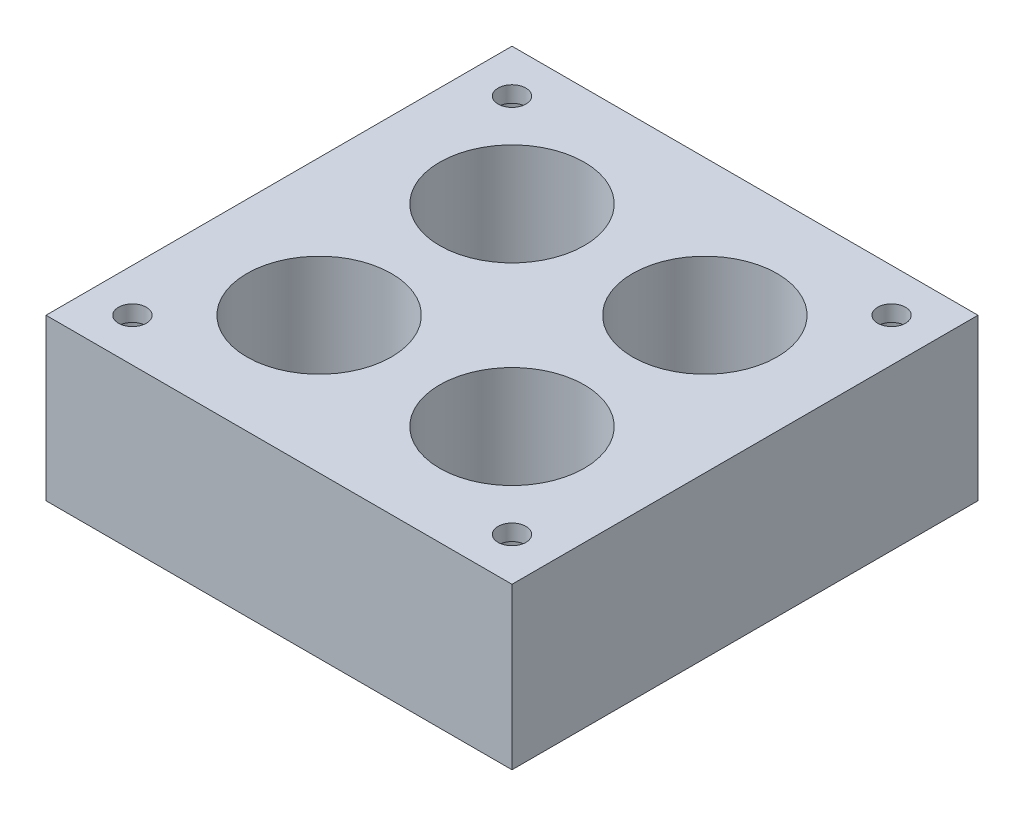
ISO-10303-21;
HEADER;
FILE_DESCRIPTION(('STEP AP214'),'2;1');
FILE_NAME('part.step','',(''),(''),'','','');
FILE_SCHEMA(('AUTOMOTIVE_DESIGN { 1 0 10303 214 1 1 1 1 }'));
ENDSEC;
DATA;
#1=APPLICATION_CONTEXT('core data for automotive mechanical design processes');
#2=APPLICATION_PROTOCOL_DEFINITION('international standard','automotive_design',2000,#1);
#3=PRODUCT_CONTEXT('',#1,'mechanical');
#4=PRODUCT('Part','Part','',(#3));
#5=PRODUCT_RELATED_PRODUCT_CATEGORY('part','',(#4));
#6=PRODUCT_DEFINITION_FORMATION('','',#4);
#7=PRODUCT_DEFINITION_CONTEXT('part definition',#1,'design');
#8=PRODUCT_DEFINITION('design','',#6,#7);
#9=PRODUCT_DEFINITION_SHAPE('','',#8);
#10=(LENGTH_UNIT() NAMED_UNIT(*) SI_UNIT(.MILLI.,.METRE.));
#11=(NAMED_UNIT(*) PLANE_ANGLE_UNIT() SI_UNIT($,.RADIAN.));
#12=(NAMED_UNIT(*) SI_UNIT($,.STERADIAN.) SOLID_ANGLE_UNIT());
#13=UNCERTAINTY_MEASURE_WITH_UNIT(LENGTH_MEASURE(1.E-05),#10,'distance_accuracy_value','');
#14=(GEOMETRIC_REPRESENTATION_CONTEXT(3) GLOBAL_UNCERTAINTY_ASSIGNED_CONTEXT((#13)) GLOBAL_UNIT_ASSIGNED_CONTEXT((#10,
#11,#12)) REPRESENTATION_CONTEXT('',''));
#15=CARTESIAN_POINT('',(0.,0.,0.));
#16=DIRECTION('',(0.,0.,1.));
#17=DIRECTION('',(1.,0.,0.));
#18=AXIS2_PLACEMENT_3D('',#15,#16,#17);
#19=CARTESIAN_POINT('',(13.5774627629243,12.7,-11.723859629765));
#20=DIRECTION('',(0.,-1.,0.));
#21=DIRECTION('',(0.,0.,-1.));
#22=AXIS2_PLACEMENT_3D('',#19,#20,#21);
#23=CYLINDRICAL_SURFACE('',#22,1.0999978);
#24=CARTESIAN_POINT('',(13.5774627629243,12.7,-11.723859629765));
#25=DIRECTION('',(0.,1.,0.));
#26=DIRECTION('',(0.,0.,-1.));
#27=AXIS2_PLACEMENT_3D('',#24,#25,#26);
#28=CIRCLE('',#27,1.0999978);
#29=CARTESIAN_POINT('',(13.5774627629243,12.7,-12.823857429765));
#30=VERTEX_POINT('',#29);
#31=EDGE_CURVE('E186',#30,#30,#28,.T.);
#32=ORIENTED_EDGE('',*,*,#31,.T.);
#33=EDGE_LOOP('',(#32));
#34=FACE_BOUND('',#33,.T.);
#35=CARTESIAN_POINT('',(13.5774627629243,11.43,-11.723859629765));
#36=DIRECTION('',(0.,-1.,0.));
#37=DIRECTION('',(0.,0.,-1.));
#38=AXIS2_PLACEMENT_3D('',#35,#36,#37);
#39=CIRCLE('',#38,1.0999978);
#40=CARTESIAN_POINT('',(13.5774627629243,11.43,-12.823857429765));
#41=VERTEX_POINT('',#40);
#42=EDGE_CURVE('E132',#41,#41,#39,.T.);
#43=ORIENTED_EDGE('',*,*,#42,.T.);
#44=EDGE_LOOP('',(#43));
#45=FACE_BOUND('',#44,.T.);
#46=ADVANCED_FACE('F32',(#34,#45),#23,.F.);
#47=CARTESIAN_POINT('',(-16.4225280370757,12.7,18.276131170235));
#48=DIRECTION('',(0.,-1.,0.));
#49=DIRECTION('',(0.,0.,-1.));
#50=AXIS2_PLACEMENT_3D('',#47,#48,#49);
#51=CYLINDRICAL_SURFACE('',#50,1.0999978);
#52=CARTESIAN_POINT('',(-16.4225280370757,12.7,18.276131170235));
#53=DIRECTION('',(0.,1.,0.));
#54=DIRECTION('',(0.,0.,-1.));
#55=AXIS2_PLACEMENT_3D('',#52,#53,#54);
#56=CIRCLE('',#55,1.0999978);
#57=CARTESIAN_POINT('',(-16.4225280370757,12.7,17.176133370235));
#58=VERTEX_POINT('',#57);
#59=EDGE_CURVE('E180',#58,#58,#56,.T.);
#60=ORIENTED_EDGE('',*,*,#59,.T.);
#61=EDGE_LOOP('',(#60));
#62=FACE_BOUND('',#61,.T.);
#63=CARTESIAN_POINT('',(-16.4225280370757,11.43,18.276131170235));
#64=DIRECTION('',(0.,-1.,0.));
#65=DIRECTION('',(0.,0.,-1.));
#66=AXIS2_PLACEMENT_3D('',#63,#64,#65);
#67=CIRCLE('',#66,1.0999978);
#68=CARTESIAN_POINT('',(-16.4225280370757,11.43,17.176133370235));
#69=VERTEX_POINT('',#68);
#70=EDGE_CURVE('E125',#69,#69,#67,.T.);
#71=ORIENTED_EDGE('',*,*,#70,.T.);
#72=EDGE_LOOP('',(#71));
#73=FACE_BOUND('',#72,.T.);
#74=ADVANCED_FACE('F212',(#62,#73),#51,.F.);
#75=CARTESIAN_POINT('',(6.19746736292429,12.7,10.896135770235));
#76=DIRECTION('',(0.,-1.,0.));
#77=DIRECTION('',(0.,0.,-1.));
#78=AXIS2_PLACEMENT_3D('',#75,#76,#77);
#79=CYLINDRICAL_SURFACE('',#78,2.159);
#80=CARTESIAN_POINT('',(6.19746736292429,0.,10.896135770235));
#81=DIRECTION('',(0.,1.,0.));
#82=DIRECTION('',(0.,0.,1.));
#83=AXIS2_PLACEMENT_3D('',#80,#81,#82);
#84=CIRCLE('',#83,2.159);
#85=CARTESIAN_POINT('',(6.19746736292429,0.,13.055135770235));
#86=VERTEX_POINT('',#85);
#87=EDGE_CURVE('E171',#86,#86,#84,.T.);
#88=ORIENTED_EDGE('',*,*,#87,.F.);
#89=EDGE_LOOP('',(#88));
#90=FACE_BOUND('',#89,.T.);
#91=CARTESIAN_POINT('',(6.19746736292429,1.27,10.896135770235));
#92=DIRECTION('',(0.,1.,0.));
#93=DIRECTION('',(0.,0.,1.));
#94=AXIS2_PLACEMENT_3D('',#91,#92,#93);
#95=CIRCLE('',#94,2.159);
#96=CARTESIAN_POINT('',(6.19746736292429,1.27,13.055135770235));
#97=VERTEX_POINT('',#96);
#98=EDGE_CURVE('E117',#97,#97,#95,.T.);
#99=ORIENTED_EDGE('',*,*,#98,.T.);
#100=EDGE_LOOP('',(#99));
#101=FACE_BOUND('',#100,.T.);
#102=ADVANCED_FACE('F205',(#90,#101),#79,.F.);
#103=CARTESIAN_POINT('',(-9.04253263707571,12.7,-4.34386422976501));
#104=DIRECTION('',(0.,-1.,0.));
#105=DIRECTION('',(0.,0.,-1.));
#106=AXIS2_PLACEMENT_3D('',#103,#104,#105);
#107=CYLINDRICAL_SURFACE('',#106,2.159);
#108=CARTESIAN_POINT('',(-9.04253263707571,0.,-4.34386422976501));
#109=DIRECTION('',(0.,1.,0.));
#110=DIRECTION('',(0.,0.,1.));
#111=AXIS2_PLACEMENT_3D('',#108,#109,#110);
#112=CIRCLE('',#111,2.159);
#113=CARTESIAN_POINT('',(-9.04253263707571,0.,-2.18486422976501));
#114=VERTEX_POINT('',#113);
#115=EDGE_CURVE('E174',#114,#114,#112,.T.);
#116=ORIENTED_EDGE('',*,*,#115,.F.);
#117=EDGE_LOOP('',(#116));
#118=FACE_BOUND('',#117,.T.);
#119=CARTESIAN_POINT('',(-9.04253263707571,1.27,-4.34386422976501));
#120=DIRECTION('',(0.,1.,0.));
#121=DIRECTION('',(0.,0.,1.));
#122=AXIS2_PLACEMENT_3D('',#119,#120,#121);
#123=CIRCLE('',#122,2.159);
#124=CARTESIAN_POINT('',(-9.04253263707571,1.27,-2.18486422976501));
#125=VERTEX_POINT('',#124);
#126=EDGE_CURVE('E109',#125,#125,#123,.T.);
#127=ORIENTED_EDGE('',*,*,#126,.T.);
#128=EDGE_LOOP('',(#127));
#129=FACE_BOUND('',#128,.T.);
#130=ADVANCED_FACE('F196',(#118,#129),#107,.F.);
#131=CARTESIAN_POINT('',(0.,12.7,0.));
#132=DIRECTION('',(0.,1.,0.));
#133=DIRECTION('',(0.,0.,1.));
#134=AXIS2_PLACEMENT_3D('',#131,#132,#133);
#135=PLANE('',#134);
#136=CARTESIAN_POINT('',(6.19746736292428,12.7,-4.34386422976501));
#137=DIRECTION('',(0.,1.,0.));
#138=DIRECTION('',(0.,0.,-1.));
#139=AXIS2_PLACEMENT_3D('',#136,#137,#138);
#140=CIRCLE('',#139,5.715);
#141=CARTESIAN_POINT('',(6.19746736292428,12.7,-10.058864229765));
#142=VERTEX_POINT('',#141);
#143=EDGE_CURVE('E151',#142,#142,#140,.T.);
#144=ORIENTED_EDGE('',*,*,#143,.F.);
#145=EDGE_LOOP('',(#144));
#146=FACE_BOUND('',#145,.T.);
#147=CARTESIAN_POINT('',(6.19746736292428,12.7,10.896135770235));
#148=DIRECTION('',(0.,1.,0.));
#149=DIRECTION('',(0.,0.,1.));
#150=AXIS2_PLACEMENT_3D('',#147,#148,#149);
#151=CIRCLE('',#150,5.715);
#152=CARTESIAN_POINT('',(6.19746736292428,12.7,16.611135770235));
#153=VERTEX_POINT('',#152);
#154=EDGE_CURVE('E157',#153,#153,#151,.T.);
#155=ORIENTED_EDGE('',*,*,#154,.F.);
#156=EDGE_LOOP('',(#155));
#157=FACE_BOUND('',#156,.T.);
#158=CARTESIAN_POINT('',(-9.04253263707571,12.7,10.896135770235));
#159=DIRECTION('',(0.,1.,0.));
#160=DIRECTION('',(0.,0.,-1.));
#161=AXIS2_PLACEMENT_3D('',#158,#159,#160);
#162=CIRCLE('',#161,5.715);
#163=CARTESIAN_POINT('',(-9.04253263707571,12.7,5.18113577023499));
#164=VERTEX_POINT('',#163);
#165=EDGE_CURVE('E128',#164,#164,#162,.T.);
#166=ORIENTED_EDGE('',*,*,#165,.F.);
#167=EDGE_LOOP('',(#166));
#168=FACE_BOUND('',#167,.T.);
#169=CARTESIAN_POINT('',(-9.04253263707571,12.7,-4.34386422976501));
#170=DIRECTION('',(0.,1.,0.));
#171=DIRECTION('',(0.,0.,1.));
#172=AXIS2_PLACEMENT_3D('',#169,#170,#171);
#173=CIRCLE('',#172,5.715);
#174=CARTESIAN_POINT('',(-9.04253263707571,12.7,1.37113577023499));
#175=VERTEX_POINT('',#174);
#176=EDGE_CURVE('E124',#175,#175,#173,.T.);
#177=ORIENTED_EDGE('',*,*,#176,.F.);
#178=EDGE_LOOP('',(#177));
#179=FACE_BOUND('',#178,.T.);
#180=CARTESIAN_POINT('',(13.5774627629243,12.7,18.276131170235));
#181=DIRECTION('',(0.,1.,0.));
#182=DIRECTION('',(0.,0.,1.));
#183=AXIS2_PLACEMENT_3D('',#180,#181,#182);
#184=CIRCLE('',#183,1.0999978);
#185=CARTESIAN_POINT('',(13.5774627629243,12.7,19.376128970235));
#186=VERTEX_POINT('',#185);
#187=EDGE_CURVE('E183',#186,#186,#184,.T.);
#188=ORIENTED_EDGE('',*,*,#187,.F.);
#189=EDGE_LOOP('',(#188));
#190=FACE_BOUND('',#189,.T.);
#191=CARTESIAN_POINT('',(-16.4225280370757,12.7,-11.723859629765));
#192=DIRECTION('',(0.,1.,0.));
#193=DIRECTION('',(0.,0.,1.));
#194=AXIS2_PLACEMENT_3D('',#191,#192,#193);
#195=CIRCLE('',#194,1.0999978);
#196=CARTESIAN_POINT('',(-16.4225280370757,12.7,-10.623861829765));
#197=VERTEX_POINT('',#196);
#198=EDGE_CURVE('E103',#197,#197,#195,.T.);
#199=ORIENTED_EDGE('',*,*,#198,.F.);
#200=EDGE_LOOP('',(#199));
#201=FACE_BOUND('',#200,.T.);
#202=DIRECTION('',(0.,0.,1.));
#203=VECTOR('',#202,1.);
#204=CARTESIAN_POINT('',(-19.8375326370757,12.7,-15.138864229765));
#205=LINE('',#204,#203);
#206=CARTESIAN_POINT('',(-19.8375326370757,12.7,-15.138864229765));
#207=VERTEX_POINT('',#206);
#208=CARTESIAN_POINT('',(-19.8375326370757,12.7,21.691135770235));
#209=VERTEX_POINT('',#208);
#210=EDGE_CURVE('E87',#207,#209,#205,.T.);
#211=ORIENTED_EDGE('',*,*,#210,.T.);
#212=DIRECTION('',(1.,0.,0.));
#213=VECTOR('',#212,1.);
#214=CARTESIAN_POINT('',(-19.8375326370757,12.7,21.691135770235));
#215=LINE('',#214,#213);
#216=CARTESIAN_POINT('',(16.9924673629243,12.7,21.691135770235));
#217=VERTEX_POINT('',#216);
#218=EDGE_CURVE('E81',#209,#217,#215,.T.);
#219=ORIENTED_EDGE('',*,*,#218,.T.);
#220=DIRECTION('',(0.,0.,-1.));
#221=VECTOR('',#220,1.);
#222=CARTESIAN_POINT('',(16.9924673629243,12.7,-15.138864229765));
#223=LINE('',#222,#221);
#224=CARTESIAN_POINT('',(16.9924673629243,12.7,-15.138864229765));
#225=VERTEX_POINT('',#224);
#226=EDGE_CURVE('E85',#217,#225,#223,.T.);
#227=ORIENTED_EDGE('',*,*,#226,.T.);
#228=DIRECTION('',(-1.,0.,0.));
#229=VECTOR('',#228,1.);
#230=CARTESIAN_POINT('',(-19.8375326370757,12.7,-15.138864229765));
#231=LINE('',#230,#229);
#232=EDGE_CURVE('E51',#225,#207,#231,.T.);
#233=ORIENTED_EDGE('',*,*,#232,.T.);
#234=EDGE_LOOP('',(#211,#219,#227,#233));
#235=FACE_BOUND('',#234,.T.);
#236=ORIENTED_EDGE('',*,*,#31,.F.);
#237=EDGE_LOOP('',(#236));
#238=FACE_BOUND('',#237,.T.);
#239=ORIENTED_EDGE('',*,*,#59,.F.);
#240=EDGE_LOOP('',(#239));
#241=FACE_BOUND('',#240,.T.);
#242=ADVANCED_FACE('F82',(#146,#157,#168,#179,#190,#201,#235,#238,#241),#135,.T.);
#243=CARTESIAN_POINT('',(0.,0.,0.));
#244=DIRECTION('',(0.,1.,0.));
#245=DIRECTION('',(0.,0.,1.));
#246=AXIS2_PLACEMENT_3D('',#243,#244,#245);
#247=PLANE('',#246);
#248=CARTESIAN_POINT('',(13.5774627629243,0.,18.276131170235));
#249=DIRECTION('',(0.,-1.,0.));
#250=DIRECTION('',(0.,0.,1.));
#251=AXIS2_PLACEMENT_3D('',#248,#249,#250);
#252=CIRCLE('',#251,2.54);
#253=CARTESIAN_POINT('',(13.5774627629243,0.,20.816131170235));
#254=VERTEX_POINT('',#253);
#255=EDGE_CURVE('E356',#254,#254,#252,.T.);
#256=ORIENTED_EDGE('',*,*,#255,.F.);
#257=EDGE_LOOP('',(#256));
#258=FACE_BOUND('',#257,.T.);
#259=CARTESIAN_POINT('',(13.5774627629243,0.,-11.723859629765));
#260=DIRECTION('',(0.,-1.,0.));
#261=DIRECTION('',(0.,0.,-1.));
#262=AXIS2_PLACEMENT_3D('',#259,#260,#261);
#263=CIRCLE('',#262,2.54);
#264=CARTESIAN_POINT('',(13.5774627629243,0.,-14.263859629765));
#265=VERTEX_POINT('',#264);
#266=EDGE_CURVE('E364',#265,#265,#263,.T.);
#267=ORIENTED_EDGE('',*,*,#266,.F.);
#268=EDGE_LOOP('',(#267));
#269=FACE_BOUND('',#268,.T.);
#270=CARTESIAN_POINT('',(-16.4225280370757,0.,-11.723859629765));
#271=DIRECTION('',(0.,-1.,0.));
#272=DIRECTION('',(0.,0.,1.));
#273=AXIS2_PLACEMENT_3D('',#270,#271,#272);
#274=CIRCLE('',#273,2.54);
#275=CARTESIAN_POINT('',(-16.4225280370757,0.,-9.18385962976501));
#276=VERTEX_POINT('',#275);
#277=EDGE_CURVE('E369',#276,#276,#274,.T.);
#278=ORIENTED_EDGE('',*,*,#277,.F.);
#279=EDGE_LOOP('',(#278));
#280=FACE_BOUND('',#279,.T.);
#281=CARTESIAN_POINT('',(-16.4225280370757,0.,18.276131170235));
#282=DIRECTION('',(0.,-1.,0.));
#283=DIRECTION('',(0.,0.,-1.));
#284=AXIS2_PLACEMENT_3D('',#281,#282,#283);
#285=CIRCLE('',#284,2.54);
#286=CARTESIAN_POINT('',(-16.4225280370757,0.,15.736131170235));
#287=VERTEX_POINT('',#286);
#288=EDGE_CURVE('E138',#287,#287,#285,.T.);
#289=ORIENTED_EDGE('',*,*,#288,.F.);
#290=EDGE_LOOP('',(#289));
#291=FACE_BOUND('',#290,.T.);
#292=DIRECTION('',(0.,0.,1.));
#293=VECTOR('',#292,1.);
#294=CARTESIAN_POINT('',(-19.8375326370757,0.,-15.138864229765));
#295=LINE('',#294,#293);
#296=CARTESIAN_POINT('',(-19.8375326370757,0.,-15.138864229765));
#297=VERTEX_POINT('',#296);
#298=CARTESIAN_POINT('',(-19.8375326370757,0.,21.691135770235));
#299=VERTEX_POINT('',#298);
#300=EDGE_CURVE('E100',#297,#299,#295,.T.);
#301=ORIENTED_EDGE('',*,*,#300,.F.);
#302=DIRECTION('',(-1.,0.,0.));
#303=VECTOR('',#302,1.);
#304=CARTESIAN_POINT('',(-19.8375326370757,0.,-15.138864229765));
#305=LINE('',#304,#303);
#306=CARTESIAN_POINT('',(16.9924673629243,0.,-15.138864229765));
#307=VERTEX_POINT('',#306);
#308=EDGE_CURVE('E74',#307,#297,#305,.T.);
#309=ORIENTED_EDGE('',*,*,#308,.F.);
#310=DIRECTION('',(0.,0.,-1.));
#311=VECTOR('',#310,1.);
#312=CARTESIAN_POINT('',(16.9924673629243,0.,-15.138864229765));
#313=LINE('',#312,#311);
#314=CARTESIAN_POINT('',(16.9924673629243,0.,21.691135770235));
#315=VERTEX_POINT('',#314);
#316=EDGE_CURVE('E68',#315,#307,#313,.T.);
#317=ORIENTED_EDGE('',*,*,#316,.F.);
#318=DIRECTION('',(1.,0.,0.));
#319=VECTOR('',#318,1.);
#320=CARTESIAN_POINT('',(-19.8375326370757,0.,21.691135770235));
#321=LINE('',#320,#319);
#322=EDGE_CURVE('E91',#299,#315,#321,.T.);
#323=ORIENTED_EDGE('',*,*,#322,.F.);
#324=EDGE_LOOP('',(#301,#309,#317,#323));
#325=FACE_BOUND('',#324,.T.);
#326=CARTESIAN_POINT('',(6.19746736292428,0.,-4.34386422976501));
#327=DIRECTION('',(0.,1.,0.));
#328=DIRECTION('',(0.,0.,-1.));
#329=AXIS2_PLACEMENT_3D('',#326,#327,#328);
#330=CIRCLE('',#329,2.159);
#331=CARTESIAN_POINT('',(6.19746736292428,0.,-6.50286422976501));
#332=VERTEX_POINT('',#331);
#333=EDGE_CURVE('E177',#332,#332,#330,.T.);
#334=ORIENTED_EDGE('',*,*,#333,.T.);
#335=EDGE_LOOP('',(#334));
#336=FACE_BOUND('',#335,.T.);
#337=ORIENTED_EDGE('',*,*,#115,.T.);
#338=EDGE_LOOP('',(#337));
#339=FACE_BOUND('',#338,.T.);
#340=ORIENTED_EDGE('',*,*,#87,.T.);
#341=EDGE_LOOP('',(#340));
#342=FACE_BOUND('',#341,.T.);
#343=CARTESIAN_POINT('',(-9.04253263707571,0.,10.896135770235));
#344=DIRECTION('',(0.,1.,0.));
#345=DIRECTION('',(0.,0.,-1.));
#346=AXIS2_PLACEMENT_3D('',#343,#344,#345);
#347=CIRCLE('',#346,2.159);
#348=CARTESIAN_POINT('',(-9.04253263707571,0.,8.73713577023499));
#349=VERTEX_POINT('',#348);
#350=EDGE_CURVE('E112',#349,#349,#347,.T.);
#351=ORIENTED_EDGE('',*,*,#350,.T.);
#352=EDGE_LOOP('',(#351));
#353=FACE_BOUND('',#352,.T.);
#354=ADVANCED_FACE('F195',(#258,#269,#280,#291,#325,#336,#339,#342,#353),#247,.F.);
#355=CARTESIAN_POINT('',(-19.8375326370757,12.7,-15.138864229765));
#356=DIRECTION('',(1.,0.,0.));
#357=DIRECTION('',(0.,0.,-1.));
#358=AXIS2_PLACEMENT_3D('',#355,#356,#357);
#359=PLANE('',#358);
#360=ORIENTED_EDGE('',*,*,#300,.T.);
#361=DIRECTION('',(0.,-1.,0.));
#362=VECTOR('',#361,1.);
#363=CARTESIAN_POINT('',(-19.8375326370757,12.7,21.691135770235));
#364=LINE('',#363,#362);
#365=EDGE_CURVE('E11',#209,#299,#364,.T.);
#366=ORIENTED_EDGE('',*,*,#365,.F.);
#367=ORIENTED_EDGE('',*,*,#210,.F.);
#368=DIRECTION('',(0.,-1.,0.));
#369=VECTOR('',#368,1.);
#370=CARTESIAN_POINT('',(-19.8375326370757,12.7,-15.138864229765));
#371=LINE('',#370,#369);
#372=EDGE_CURVE('E96',#207,#297,#371,.T.);
#373=ORIENTED_EDGE('',*,*,#372,.T.);
#374=EDGE_LOOP('',(#360,#366,#367,#373));
#375=FACE_BOUND('',#374,.T.);
#376=ADVANCED_FACE('F34',(#375),#359,.F.);
#377=CARTESIAN_POINT('',(-19.8375326370757,12.7,21.691135770235));
#378=DIRECTION('',(0.,0.,-1.));
#379=DIRECTION('',(-1.,0.,0.));
#380=AXIS2_PLACEMENT_3D('',#377,#378,#379);
#381=PLANE('',#380);
#382=ORIENTED_EDGE('',*,*,#322,.T.);
#383=DIRECTION('',(0.,-1.,0.));
#384=VECTOR('',#383,1.);
#385=CARTESIAN_POINT('',(16.9924673629243,12.7,21.691135770235));
#386=LINE('',#385,#384);
#387=EDGE_CURVE('E42',#217,#315,#386,.T.);
#388=ORIENTED_EDGE('',*,*,#387,.F.);
#389=ORIENTED_EDGE('',*,*,#218,.F.);
#390=ORIENTED_EDGE('',*,*,#365,.T.);
#391=EDGE_LOOP('',(#382,#388,#389,#390));
#392=FACE_BOUND('',#391,.T.);
#393=ADVANCED_FACE('F90',(#392),#381,.F.);
#394=CARTESIAN_POINT('',(16.9924673629243,12.7,-15.138864229765));
#395=DIRECTION('',(-1.,0.,0.));
#396=DIRECTION('',(0.,0.,1.));
#397=AXIS2_PLACEMENT_3D('',#394,#395,#396);
#398=PLANE('',#397);
#399=ORIENTED_EDGE('',*,*,#316,.T.);
#400=DIRECTION('',(0.,-1.,0.));
#401=VECTOR('',#400,1.);
#402=CARTESIAN_POINT('',(16.9924673629243,12.7,-15.138864229765));
#403=LINE('',#402,#401);
#404=EDGE_CURVE('E92',#225,#307,#403,.T.);
#405=ORIENTED_EDGE('',*,*,#404,.F.);
#406=ORIENTED_EDGE('',*,*,#226,.F.);
#407=ORIENTED_EDGE('',*,*,#387,.T.);
#408=EDGE_LOOP('',(#399,#405,#406,#407));
#409=FACE_BOUND('',#408,.T.);
#410=ADVANCED_FACE('F94',(#409),#398,.F.);
#411=CARTESIAN_POINT('',(-19.8375326370757,12.7,-15.138864229765));
#412=DIRECTION('',(0.,0.,1.));
#413=DIRECTION('',(1.,0.,0.));
#414=AXIS2_PLACEMENT_3D('',#411,#412,#413);
#415=PLANE('',#414);
#416=ORIENTED_EDGE('',*,*,#308,.T.);
#417=ORIENTED_EDGE('',*,*,#372,.F.);
#418=ORIENTED_EDGE('',*,*,#232,.F.);
#419=ORIENTED_EDGE('',*,*,#404,.T.);
#420=EDGE_LOOP('',(#416,#417,#418,#419));
#421=FACE_BOUND('',#420,.T.);
#422=ADVANCED_FACE('F223',(#421),#415,.F.);
#423=CARTESIAN_POINT('',(-16.4225280370757,12.7,-11.723859629765));
#424=DIRECTION('',(0.,-1.,0.));
#425=DIRECTION('',(0.,0.,-1.));
#426=AXIS2_PLACEMENT_3D('',#423,#424,#425);
#427=CYLINDRICAL_SURFACE('',#426,1.0999978);
#428=CARTESIAN_POINT('',(-16.4225280370757,11.43,-11.723859629765));
#429=DIRECTION('',(0.,1.,0.));
#430=DIRECTION('',(0.,0.,1.));
#431=AXIS2_PLACEMENT_3D('',#428,#429,#430);
#432=CIRCLE('',#431,1.0999978);
#433=CARTESIAN_POINT('',(-16.4225280370757,11.43,-10.623861829765));
#434=VERTEX_POINT('',#433);
#435=EDGE_CURVE('E36',#434,#434,#432,.T.);
#436=ORIENTED_EDGE('',*,*,#435,.F.);
#437=EDGE_LOOP('',(#436));
#438=FACE_BOUND('',#437,.T.);
#439=ORIENTED_EDGE('',*,*,#198,.T.);
#440=EDGE_LOOP('',(#439));
#441=FACE_BOUND('',#440,.T.);
#442=ADVANCED_FACE('F192',(#438,#441),#427,.F.);
#443=CARTESIAN_POINT('',(13.5774627629243,12.7,18.276131170235));
#444=DIRECTION('',(0.,-1.,0.));
#445=DIRECTION('',(0.,0.,-1.));
#446=AXIS2_PLACEMENT_3D('',#443,#444,#445);
#447=CYLINDRICAL_SURFACE('',#446,1.0999978);
#448=CARTESIAN_POINT('',(13.5774627629243,11.43,18.276131170235));
#449=DIRECTION('',(0.,1.,0.));
#450=DIRECTION('',(0.,0.,1.));
#451=AXIS2_PLACEMENT_3D('',#448,#449,#450);
#452=CIRCLE('',#451,1.0999978);
#453=CARTESIAN_POINT('',(13.5774627629243,11.43,19.376128970235));
#454=VERTEX_POINT('',#453);
#455=EDGE_CURVE('E130',#454,#454,#452,.T.);
#456=ORIENTED_EDGE('',*,*,#455,.F.);
#457=EDGE_LOOP('',(#456));
#458=FACE_BOUND('',#457,.T.);
#459=ORIENTED_EDGE('',*,*,#187,.T.);
#460=EDGE_LOOP('',(#459));
#461=FACE_BOUND('',#460,.T.);
#462=ADVANCED_FACE('F221',(#458,#461),#447,.F.);
#463=CARTESIAN_POINT('',(6.19746736292428,12.7,-4.34386422976501));
#464=DIRECTION('',(0.,-1.,0.));
#465=DIRECTION('',(0.,0.,-1.));
#466=AXIS2_PLACEMENT_3D('',#463,#464,#465);
#467=CYLINDRICAL_SURFACE('',#466,2.159);
#468=CARTESIAN_POINT('',(6.19746736292428,1.27,-4.34386422976501));
#469=DIRECTION('',(0.,-1.,0.));
#470=DIRECTION('',(0.,0.,-1.));
#471=AXIS2_PLACEMENT_3D('',#468,#469,#470);
#472=CIRCLE('',#471,2.159);
#473=CARTESIAN_POINT('',(6.19746736292428,1.27,-6.50286422976501));
#474=VERTEX_POINT('',#473);
#475=EDGE_CURVE('E121',#474,#474,#472,.T.);
#476=ORIENTED_EDGE('',*,*,#475,.F.);
#477=EDGE_LOOP('',(#476));
#478=FACE_BOUND('',#477,.T.);
#479=ORIENTED_EDGE('',*,*,#333,.F.);
#480=EDGE_LOOP('',(#479));
#481=FACE_BOUND('',#480,.T.);
#482=ADVANCED_FACE('F229',(#478,#481),#467,.F.);
#483=CARTESIAN_POINT('',(-9.04253263707571,12.7,10.896135770235));
#484=DIRECTION('',(0.,-1.,0.));
#485=DIRECTION('',(0.,0.,-1.));
#486=AXIS2_PLACEMENT_3D('',#483,#484,#485);
#487=CYLINDRICAL_SURFACE('',#486,2.159);
#488=CARTESIAN_POINT('',(-9.04253263707571,1.27,10.896135770235));
#489=DIRECTION('',(0.,-1.,0.));
#490=DIRECTION('',(0.,0.,-1.));
#491=AXIS2_PLACEMENT_3D('',#488,#489,#490);
#492=CIRCLE('',#491,2.159);
#493=CARTESIAN_POINT('',(-9.04253263707571,1.27,8.73713577023499));
#494=VERTEX_POINT('',#493);
#495=EDGE_CURVE('E114',#494,#494,#492,.T.);
#496=ORIENTED_EDGE('',*,*,#495,.F.);
#497=EDGE_LOOP('',(#496));
#498=FACE_BOUND('',#497,.T.);
#499=ORIENTED_EDGE('',*,*,#350,.F.);
#500=EDGE_LOOP('',(#499));
#501=FACE_BOUND('',#500,.T.);
#502=ADVANCED_FACE('F254',(#498,#501),#487,.F.);
#503=CARTESIAN_POINT('',(-9.04253263707571,1.27,-4.34386422976501));
#504=DIRECTION('',(0.,1.,0.));
#505=DIRECTION('',(0.,0.,1.));
#506=AXIS2_PLACEMENT_3D('',#503,#504,#505);
#507=CYLINDRICAL_SURFACE('',#506,5.715);
#508=CARTESIAN_POINT('',(-9.04253263707571,1.27,-4.34386422976501));
#509=DIRECTION('',(0.,1.,0.));
#510=DIRECTION('',(0.,0.,1.));
#511=AXIS2_PLACEMENT_3D('',#508,#509,#510);
#512=CIRCLE('',#511,5.715);
#513=CARTESIAN_POINT('',(-9.04253263707571,1.27,1.37113577023499));
#514=VERTEX_POINT('',#513);
#515=EDGE_CURVE('E113',#514,#514,#512,.T.);
#516=ORIENTED_EDGE('',*,*,#515,.F.);
#517=EDGE_LOOP('',(#516));
#518=FACE_BOUND('',#517,.T.);
#519=ORIENTED_EDGE('',*,*,#176,.T.);
#520=EDGE_LOOP('',(#519));
#521=FACE_BOUND('',#520,.T.);
#522=ADVANCED_FACE('F256',(#518,#521),#507,.F.);
#523=CARTESIAN_POINT('',(-9.04253263707571,1.27,-4.34386422976501));
#524=DIRECTION('',(0.,1.,0.));
#525=DIRECTION('',(0.,0.,1.));
#526=AXIS2_PLACEMENT_3D('',#523,#524,#525);
#527=PLANE('',#526);
#528=ORIENTED_EDGE('',*,*,#126,.F.);
#529=EDGE_LOOP('',(#528));
#530=FACE_BOUND('',#529,.T.);
#531=ORIENTED_EDGE('',*,*,#515,.T.);
#532=EDGE_LOOP('',(#531));
#533=FACE_BOUND('',#532,.T.);
#534=ADVANCED_FACE('F263',(#530,#533),#527,.T.);
#535=CARTESIAN_POINT('',(-9.04253263707571,1.27,10.896135770235));
#536=DIRECTION('',(0.,1.,0.));
#537=DIRECTION('',(0.,0.,1.));
#538=AXIS2_PLACEMENT_3D('',#535,#536,#537);
#539=CYLINDRICAL_SURFACE('',#538,5.715);
#540=CARTESIAN_POINT('',(-9.04253263707571,1.27,10.896135770235));
#541=DIRECTION('',(0.,1.,0.));
#542=DIRECTION('',(0.,0.,-1.));
#543=AXIS2_PLACEMENT_3D('',#540,#541,#542);
#544=CIRCLE('',#543,5.715);
#545=CARTESIAN_POINT('',(-9.04253263707571,1.27,5.18113577023499));
#546=VERTEX_POINT('',#545);
#547=EDGE_CURVE('E160',#546,#546,#544,.T.);
#548=ORIENTED_EDGE('',*,*,#547,.F.);
#549=EDGE_LOOP('',(#548));
#550=FACE_BOUND('',#549,.T.);
#551=ORIENTED_EDGE('',*,*,#165,.T.);
#552=EDGE_LOOP('',(#551));
#553=FACE_BOUND('',#552,.T.);
#554=ADVANCED_FACE('F300',(#550,#553),#539,.F.);
#555=CARTESIAN_POINT('',(-9.04253263707571,1.27,10.896135770235));
#556=DIRECTION('',(0.,-1.,0.));
#557=DIRECTION('',(0.,0.,-1.));
#558=AXIS2_PLACEMENT_3D('',#555,#556,#557);
#559=PLANE('',#558);
#560=ORIENTED_EDGE('',*,*,#495,.T.);
#561=EDGE_LOOP('',(#560));
#562=FACE_BOUND('',#561,.T.);
#563=ORIENTED_EDGE('',*,*,#547,.T.);
#564=EDGE_LOOP('',(#563));
#565=FACE_BOUND('',#564,.T.);
#566=ADVANCED_FACE('F288',(#562,#565),#559,.F.);
#567=CARTESIAN_POINT('',(6.19746736292428,1.27,10.896135770235));
#568=DIRECTION('',(0.,1.,0.));
#569=DIRECTION('',(0.,0.,1.));
#570=AXIS2_PLACEMENT_3D('',#567,#568,#569);
#571=CYLINDRICAL_SURFACE('',#570,5.715);
#572=CARTESIAN_POINT('',(6.19746736292428,1.27,10.896135770235));
#573=DIRECTION('',(0.,1.,0.));
#574=DIRECTION('',(0.,0.,1.));
#575=AXIS2_PLACEMENT_3D('',#572,#573,#574);
#576=CIRCLE('',#575,5.715);
#577=CARTESIAN_POINT('',(6.19746736292428,1.27,16.611135770235));
#578=VERTEX_POINT('',#577);
#579=EDGE_CURVE('E154',#578,#578,#576,.T.);
#580=ORIENTED_EDGE('',*,*,#579,.F.);
#581=EDGE_LOOP('',(#580));
#582=FACE_BOUND('',#581,.T.);
#583=ORIENTED_EDGE('',*,*,#154,.T.);
#584=EDGE_LOOP('',(#583));
#585=FACE_BOUND('',#584,.T.);
#586=ADVANCED_FACE('F282',(#582,#585),#571,.F.);
#587=CARTESIAN_POINT('',(6.19746736292428,1.27,10.896135770235));
#588=DIRECTION('',(0.,1.,0.));
#589=DIRECTION('',(0.,0.,1.));
#590=AXIS2_PLACEMENT_3D('',#587,#588,#589);
#591=PLANE('',#590);
#592=ORIENTED_EDGE('',*,*,#98,.F.);
#593=EDGE_LOOP('',(#592));
#594=FACE_BOUND('',#593,.T.);
#595=ORIENTED_EDGE('',*,*,#579,.T.);
#596=EDGE_LOOP('',(#595));
#597=FACE_BOUND('',#596,.T.);
#598=ADVANCED_FACE('F278',(#594,#597),#591,.T.);
#599=CARTESIAN_POINT('',(6.19746736292428,1.27,-4.34386422976501));
#600=DIRECTION('',(0.,1.,0.));
#601=DIRECTION('',(0.,0.,1.));
#602=AXIS2_PLACEMENT_3D('',#599,#600,#601);
#603=CYLINDRICAL_SURFACE('',#602,5.715);
#604=CARTESIAN_POINT('',(6.19746736292428,1.27,-4.34386422976501));
#605=DIRECTION('',(0.,1.,0.));
#606=DIRECTION('',(0.,0.,-1.));
#607=AXIS2_PLACEMENT_3D('',#604,#605,#606);
#608=CIRCLE('',#607,5.715);
#609=CARTESIAN_POINT('',(6.19746736292428,1.27,-10.058864229765));
#610=VERTEX_POINT('',#609);
#611=EDGE_CURVE('E118',#610,#610,#608,.T.);
#612=ORIENTED_EDGE('',*,*,#611,.F.);
#613=EDGE_LOOP('',(#612));
#614=FACE_BOUND('',#613,.T.);
#615=ORIENTED_EDGE('',*,*,#143,.T.);
#616=EDGE_LOOP('',(#615));
#617=FACE_BOUND('',#616,.T.);
#618=ADVANCED_FACE('F281',(#614,#617),#603,.F.);
#619=CARTESIAN_POINT('',(6.19746736292428,1.27,-4.34386422976501));
#620=DIRECTION('',(0.,-1.,0.));
#621=DIRECTION('',(0.,0.,-1.));
#622=AXIS2_PLACEMENT_3D('',#619,#620,#621);
#623=PLANE('',#622);
#624=ORIENTED_EDGE('',*,*,#475,.T.);
#625=EDGE_LOOP('',(#624));
#626=FACE_BOUND('',#625,.T.);
#627=ORIENTED_EDGE('',*,*,#611,.T.);
#628=EDGE_LOOP('',(#627));
#629=FACE_BOUND('',#628,.T.);
#630=ADVANCED_FACE('F315',(#626,#629),#623,.F.);
#631=CARTESIAN_POINT('',(-16.4225280370757,11.43,18.276131170235));
#632=DIRECTION('',(0.,-1.,0.));
#633=DIRECTION('',(0.,0.,-1.));
#634=AXIS2_PLACEMENT_3D('',#631,#632,#633);
#635=CYLINDRICAL_SURFACE('',#634,2.54);
#636=CARTESIAN_POINT('',(-16.4225280370757,11.43,18.276131170235));
#637=DIRECTION('',(0.,-1.,0.));
#638=DIRECTION('',(0.,0.,-1.));
#639=AXIS2_PLACEMENT_3D('',#636,#637,#638);
#640=CIRCLE('',#639,2.54);
#641=CARTESIAN_POINT('',(-16.4225280370757,11.43,15.736131170235));
#642=VERTEX_POINT('',#641);
#643=EDGE_CURVE('E129',#642,#642,#640,.T.);
#644=ORIENTED_EDGE('',*,*,#643,.F.);
#645=EDGE_LOOP('',(#644));
#646=FACE_BOUND('',#645,.T.);
#647=ORIENTED_EDGE('',*,*,#288,.T.);
#648=EDGE_LOOP('',(#647));
#649=FACE_BOUND('',#648,.T.);
#650=ADVANCED_FACE('F319',(#646,#649),#635,.F.);
#651=CARTESIAN_POINT('',(-16.4225280370757,11.43,18.276131170235));
#652=DIRECTION('',(0.,-1.,0.));
#653=DIRECTION('',(0.,0.,-1.));
#654=AXIS2_PLACEMENT_3D('',#651,#652,#653);
#655=PLANE('',#654);
#656=ORIENTED_EDGE('',*,*,#70,.F.);
#657=EDGE_LOOP('',(#656));
#658=FACE_BOUND('',#657,.T.);
#659=ORIENTED_EDGE('',*,*,#643,.T.);
#660=EDGE_LOOP('',(#659));
#661=FACE_BOUND('',#660,.T.);
#662=ADVANCED_FACE('F323',(#658,#661),#655,.T.);
#663=CARTESIAN_POINT('',(13.5774627629243,11.43,18.276131170235));
#664=DIRECTION('',(0.,-1.,0.));
#665=DIRECTION('',(0.,0.,-1.));
#666=AXIS2_PLACEMENT_3D('',#663,#664,#665);
#667=CYLINDRICAL_SURFACE('',#666,2.54);
#668=CARTESIAN_POINT('',(13.5774627629243,11.43,18.276131170235));
#669=DIRECTION('',(0.,-1.,0.));
#670=DIRECTION('',(0.,0.,1.));
#671=AXIS2_PLACEMENT_3D('',#668,#669,#670);
#672=CIRCLE('',#671,2.54);
#673=CARTESIAN_POINT('',(13.5774627629243,11.43,20.816131170235));
#674=VERTEX_POINT('',#673);
#675=EDGE_CURVE('E133',#674,#674,#672,.T.);
#676=ORIENTED_EDGE('',*,*,#675,.F.);
#677=EDGE_LOOP('',(#676));
#678=FACE_BOUND('',#677,.T.);
#679=ORIENTED_EDGE('',*,*,#255,.T.);
#680=EDGE_LOOP('',(#679));
#681=FACE_BOUND('',#680,.T.);
#682=ADVANCED_FACE('F327',(#678,#681),#667,.F.);
#683=CARTESIAN_POINT('',(13.5774627629243,11.43,18.276131170235));
#684=DIRECTION('',(0.,1.,0.));
#685=DIRECTION('',(0.,0.,1.));
#686=AXIS2_PLACEMENT_3D('',#683,#684,#685);
#687=PLANE('',#686);
#688=ORIENTED_EDGE('',*,*,#455,.T.);
#689=EDGE_LOOP('',(#688));
#690=FACE_BOUND('',#689,.T.);
#691=ORIENTED_EDGE('',*,*,#675,.T.);
#692=EDGE_LOOP('',(#691));
#693=FACE_BOUND('',#692,.T.);
#694=ADVANCED_FACE('F340',(#690,#693),#687,.F.);
#695=CARTESIAN_POINT('',(13.5774627629243,11.43,-11.723859629765));
#696=DIRECTION('',(0.,-1.,0.));
#697=DIRECTION('',(0.,0.,-1.));
#698=AXIS2_PLACEMENT_3D('',#695,#696,#697);
#699=CYLINDRICAL_SURFACE('',#698,2.54);
#700=CARTESIAN_POINT('',(13.5774627629243,11.43,-11.723859629765));
#701=DIRECTION('',(0.,-1.,0.));
#702=DIRECTION('',(0.,0.,-1.));
#703=AXIS2_PLACEMENT_3D('',#700,#701,#702);
#704=CIRCLE('',#703,2.54);
#705=CARTESIAN_POINT('',(13.5774627629243,11.43,-14.263859629765));
#706=VERTEX_POINT('',#705);
#707=EDGE_CURVE('E359',#706,#706,#704,.T.);
#708=ORIENTED_EDGE('',*,*,#707,.F.);
#709=EDGE_LOOP('',(#708));
#710=FACE_BOUND('',#709,.T.);
#711=ORIENTED_EDGE('',*,*,#266,.T.);
#712=EDGE_LOOP('',(#711));
#713=FACE_BOUND('',#712,.T.);
#714=ADVANCED_FACE('F337',(#710,#713),#699,.F.);
#715=CARTESIAN_POINT('',(13.5774627629243,11.43,-11.723859629765));
#716=DIRECTION('',(0.,-1.,0.));
#717=DIRECTION('',(0.,0.,-1.));
#718=AXIS2_PLACEMENT_3D('',#715,#716,#717);
#719=PLANE('',#718);
#720=ORIENTED_EDGE('',*,*,#42,.F.);
#721=EDGE_LOOP('',(#720));
#722=FACE_BOUND('',#721,.T.);
#723=ORIENTED_EDGE('',*,*,#707,.T.);
#724=EDGE_LOOP('',(#723));
#725=FACE_BOUND('',#724,.T.);
#726=ADVANCED_FACE('F333',(#722,#725),#719,.T.);
#727=CARTESIAN_POINT('',(-16.4225280370757,11.43,-11.723859629765));
#728=DIRECTION('',(0.,-1.,0.));
#729=DIRECTION('',(0.,0.,-1.));
#730=AXIS2_PLACEMENT_3D('',#727,#728,#729);
#731=CYLINDRICAL_SURFACE('',#730,2.54);
#732=CARTESIAN_POINT('',(-16.4225280370757,11.43,-11.723859629765));
#733=DIRECTION('',(0.,-1.,0.));
#734=DIRECTION('',(0.,0.,1.));
#735=AXIS2_PLACEMENT_3D('',#732,#733,#734);
#736=CIRCLE('',#735,2.54);
#737=CARTESIAN_POINT('',(-16.4225280370757,11.43,-9.18385962976501));
#738=VERTEX_POINT('',#737);
#739=EDGE_CURVE('E367',#738,#738,#736,.T.);
#740=ORIENTED_EDGE('',*,*,#739,.F.);
#741=EDGE_LOOP('',(#740));
#742=FACE_BOUND('',#741,.T.);
#743=ORIENTED_EDGE('',*,*,#277,.T.);
#744=EDGE_LOOP('',(#743));
#745=FACE_BOUND('',#744,.T.);
#746=ADVANCED_FACE('F329',(#742,#745),#731,.F.);
#747=CARTESIAN_POINT('',(-16.4225280370757,11.43,-11.723859629765));
#748=DIRECTION('',(0.,1.,0.));
#749=DIRECTION('',(0.,0.,1.));
#750=AXIS2_PLACEMENT_3D('',#747,#748,#749);
#751=PLANE('',#750);
#752=ORIENTED_EDGE('',*,*,#435,.T.);
#753=EDGE_LOOP('',(#752));
#754=FACE_BOUND('',#753,.T.);
#755=ORIENTED_EDGE('',*,*,#739,.T.);
#756=EDGE_LOOP('',(#755));
#757=FACE_BOUND('',#756,.T.);
#758=ADVANCED_FACE('F332',(#754,#757),#751,.F.);
#759=CLOSED_SHELL('',(#46,#74,#102,#130,#242,#354,#376,#393,#410,#422,#442,#462,#482,#502,#522,
#534,#554,#566,#586,#598,#618,#630,#650,#662,#682,#694,#714,#726,#746,#758));
#760=MANIFOLD_SOLID_BREP('B2',#759);
#761=ADVANCED_BREP_SHAPE_REPRESENTATION('',(#18,#760),#14);
#762=SHAPE_DEFINITION_REPRESENTATION(#9,#761);
ENDSEC;
END-ISO-10303-21;
